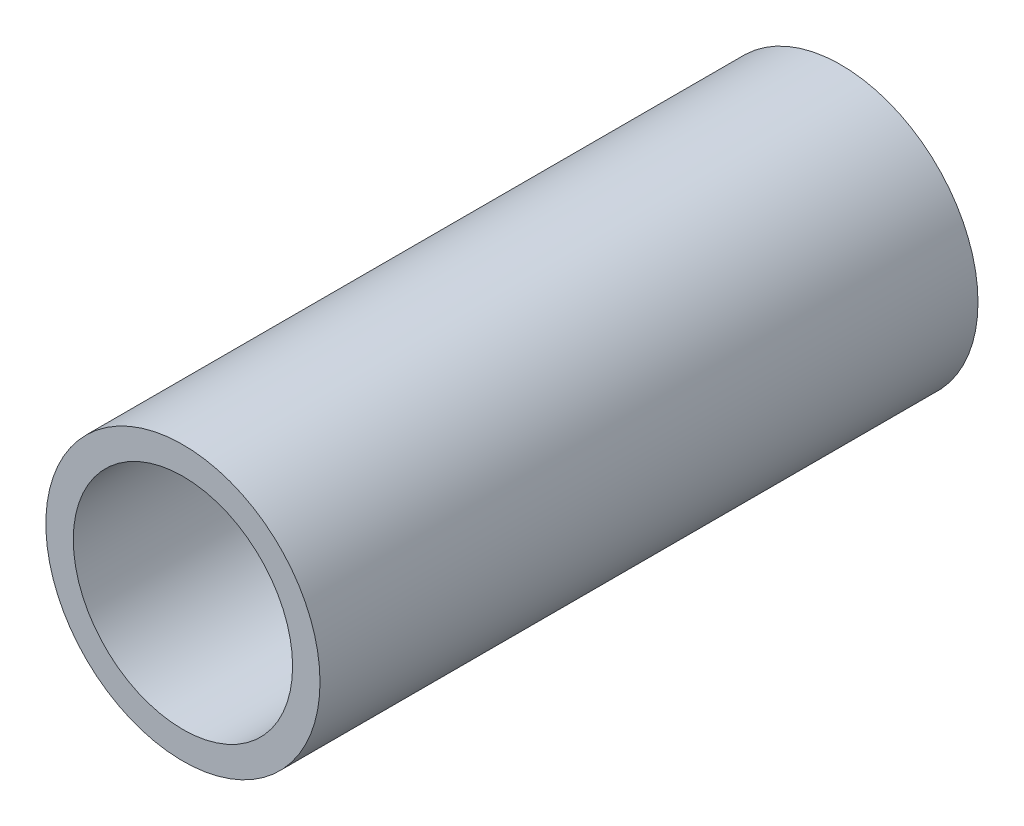
ISO-10303-21;
HEADER;
FILE_DESCRIPTION(('STEP AP214'),'2;1');
FILE_NAME('part.step','',(''),(''),'','','');
FILE_SCHEMA(('AUTOMOTIVE_DESIGN { 1 0 10303 214 1 1 1 1 }'));
ENDSEC;
DATA;
#1=APPLICATION_CONTEXT('core data for automotive mechanical design processes');
#2=APPLICATION_PROTOCOL_DEFINITION('international standard','automotive_design',2000,#1);
#3=PRODUCT_CONTEXT('',#1,'mechanical');
#4=PRODUCT('Part','Part','',(#3));
#5=PRODUCT_RELATED_PRODUCT_CATEGORY('part','',(#4));
#6=PRODUCT_DEFINITION_FORMATION('','',#4);
#7=PRODUCT_DEFINITION_CONTEXT('part definition',#1,'design');
#8=PRODUCT_DEFINITION('design','',#6,#7);
#9=PRODUCT_DEFINITION_SHAPE('','',#8);
#10=(LENGTH_UNIT() NAMED_UNIT(*) SI_UNIT(.MILLI.,.METRE.));
#11=(NAMED_UNIT(*) PLANE_ANGLE_UNIT() SI_UNIT($,.RADIAN.));
#12=(NAMED_UNIT(*) SI_UNIT($,.STERADIAN.) SOLID_ANGLE_UNIT());
#13=UNCERTAINTY_MEASURE_WITH_UNIT(LENGTH_MEASURE(1.E-05),#10,'distance_accuracy_value','');
#14=(GEOMETRIC_REPRESENTATION_CONTEXT(3) GLOBAL_UNCERTAINTY_ASSIGNED_CONTEXT((#13)) GLOBAL_UNIT_ASSIGNED_CONTEXT((#10,
#11,#12)) REPRESENTATION_CONTEXT('',''));
#15=CARTESIAN_POINT('',(0.,0.,0.));
#16=DIRECTION('',(0.,0.,1.));
#17=DIRECTION('',(1.,0.,0.));
#18=AXIS2_PLACEMENT_3D('',#15,#16,#17);
#19=CARTESIAN_POINT('',(0.,0.,120.));
#20=DIRECTION('',(0.,0.,-1.));
#21=DIRECTION('',(-1.,0.,0.));
#22=AXIS2_PLACEMENT_3D('',#19,#20,#21);
#23=CYLINDRICAL_SURFACE('',#22,25.);
#24=CARTESIAN_POINT('',(0.,0.,120.));
#25=DIRECTION('',(0.,0.,1.));
#26=DIRECTION('',(1.,0.,0.));
#27=AXIS2_PLACEMENT_3D('',#24,#25,#26);
#28=CIRCLE('',#27,25.);
#29=CARTESIAN_POINT('',(25.,0.,120.));
#30=VERTEX_POINT('',#29);
#31=EDGE_CURVE('E10',#30,#30,#28,.T.);
#32=ORIENTED_EDGE('',*,*,#31,.F.);
#33=EDGE_LOOP('',(#32));
#34=FACE_BOUND('',#33,.T.);
#35=CARTESIAN_POINT('',(0.,0.,0.));
#36=DIRECTION('',(0.,0.,1.));
#37=DIRECTION('',(1.,0.,0.));
#38=AXIS2_PLACEMENT_3D('',#35,#36,#37);
#39=CIRCLE('',#38,25.);
#40=CARTESIAN_POINT('',(25.,0.,0.));
#41=VERTEX_POINT('',#40);
#42=EDGE_CURVE('E40',#41,#41,#39,.T.);
#43=ORIENTED_EDGE('',*,*,#42,.T.);
#44=EDGE_LOOP('',(#43));
#45=FACE_BOUND('',#44,.T.);
#46=ADVANCED_FACE('F37',(#34,#45),#23,.T.);
#47=CARTESIAN_POINT('',(0.,0.,120.));
#48=DIRECTION('',(0.,0.,1.));
#49=DIRECTION('',(1.,0.,0.));
#50=AXIS2_PLACEMENT_3D('',#47,#48,#49);
#51=PLANE('',#50);
#52=CARTESIAN_POINT('',(0.,0.,120.));
#53=DIRECTION('',(0.,0.,1.));
#54=DIRECTION('',(1.,0.,0.));
#55=AXIS2_PLACEMENT_3D('',#52,#53,#54);
#56=CIRCLE('',#55,20.);
#57=CARTESIAN_POINT('',(20.,0.,120.));
#58=VERTEX_POINT('',#57);
#59=EDGE_CURVE('E49',#58,#58,#56,.T.);
#60=ORIENTED_EDGE('',*,*,#59,.F.);
#61=EDGE_LOOP('',(#60));
#62=FACE_BOUND('',#61,.T.);
#63=ORIENTED_EDGE('',*,*,#31,.T.);
#64=EDGE_LOOP('',(#63));
#65=FACE_BOUND('',#64,.T.);
#66=ADVANCED_FACE('F64',(#62,#65),#51,.T.);
#67=CARTESIAN_POINT('',(0.,0.,0.));
#68=DIRECTION('',(0.,0.,1.));
#69=DIRECTION('',(1.,0.,0.));
#70=AXIS2_PLACEMENT_3D('',#67,#68,#69);
#71=PLANE('',#70);
#72=CARTESIAN_POINT('',(0.,0.,0.));
#73=DIRECTION('',(0.,0.,1.));
#74=DIRECTION('',(1.,0.,0.));
#75=AXIS2_PLACEMENT_3D('',#72,#73,#74);
#76=CIRCLE('',#75,20.);
#77=CARTESIAN_POINT('',(20.,0.,0.));
#78=VERTEX_POINT('',#77);
#79=EDGE_CURVE('E47',#78,#78,#76,.T.);
#80=ORIENTED_EDGE('',*,*,#79,.T.);
#81=EDGE_LOOP('',(#80));
#82=FACE_BOUND('',#81,.T.);
#83=ORIENTED_EDGE('',*,*,#42,.F.);
#84=EDGE_LOOP('',(#83));
#85=FACE_BOUND('',#84,.T.);
#86=ADVANCED_FACE('F55',(#82,#85),#71,.F.);
#87=CARTESIAN_POINT('',(0.,0.,0.));
#88=DIRECTION('',(0.,0.,1.));
#89=DIRECTION('',(1.,0.,0.));
#90=AXIS2_PLACEMENT_3D('',#87,#88,#89);
#91=CYLINDRICAL_SURFACE('',#90,20.);
#92=ORIENTED_EDGE('',*,*,#79,.F.);
#93=EDGE_LOOP('',(#92));
#94=FACE_BOUND('',#93,.T.);
#95=ORIENTED_EDGE('',*,*,#59,.T.);
#96=EDGE_LOOP('',(#95));
#97=FACE_BOUND('',#96,.T.);
#98=ADVANCED_FACE('F58',(#94,#97),#91,.F.);
#99=CLOSED_SHELL('',(#46,#66,#86,#98));
#100=MANIFOLD_SOLID_BREP('B2',#99);
#101=ADVANCED_BREP_SHAPE_REPRESENTATION('',(#18,#100),#14);
#102=SHAPE_DEFINITION_REPRESENTATION(#9,#101);
ENDSEC;
END-ISO-10303-21;
